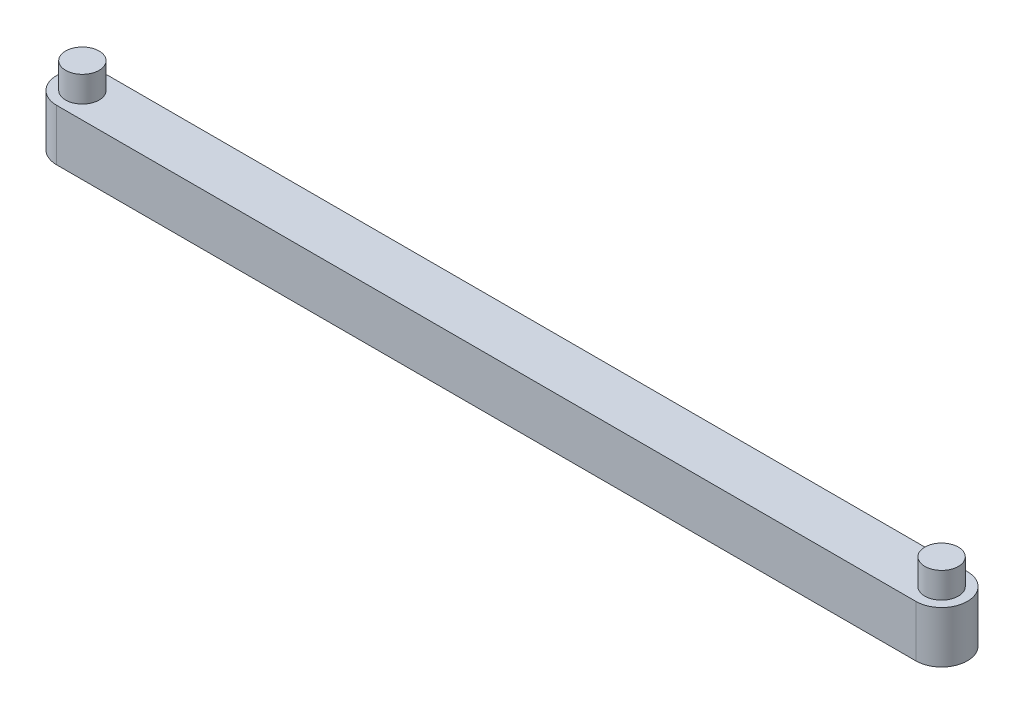
ISO-10303-21;
HEADER;
FILE_DESCRIPTION(('STEP AP214'),'2;1');
FILE_NAME('part.step','',(''),(''),'','','');
FILE_SCHEMA(('AUTOMOTIVE_DESIGN { 1 0 10303 214 1 1 1 1 }'));
ENDSEC;
DATA;
#1=APPLICATION_CONTEXT('core data for automotive mechanical design processes');
#2=APPLICATION_PROTOCOL_DEFINITION('international standard','automotive_design',2000,#1);
#3=PRODUCT_CONTEXT('',#1,'mechanical');
#4=PRODUCT('Part','Part','',(#3));
#5=PRODUCT_RELATED_PRODUCT_CATEGORY('part','',(#4));
#6=PRODUCT_DEFINITION_FORMATION('','',#4);
#7=PRODUCT_DEFINITION_CONTEXT('part definition',#1,'design');
#8=PRODUCT_DEFINITION('design','',#6,#7);
#9=PRODUCT_DEFINITION_SHAPE('','',#8);
#10=(LENGTH_UNIT() NAMED_UNIT(*) SI_UNIT(.MILLI.,.METRE.));
#11=(NAMED_UNIT(*) PLANE_ANGLE_UNIT() SI_UNIT($,.RADIAN.));
#12=(NAMED_UNIT(*) SI_UNIT($,.STERADIAN.) SOLID_ANGLE_UNIT());
#13=UNCERTAINTY_MEASURE_WITH_UNIT(LENGTH_MEASURE(1.E-05),#10,'distance_accuracy_value','');
#14=(GEOMETRIC_REPRESENTATION_CONTEXT(3) GLOBAL_UNCERTAINTY_ASSIGNED_CONTEXT((#13)) GLOBAL_UNIT_ASSIGNED_CONTEXT((#10,
#11,#12)) REPRESENTATION_CONTEXT('',''));
#15=CARTESIAN_POINT('',(0.,0.,0.));
#16=DIRECTION('',(0.,0.,1.));
#17=DIRECTION('',(1.,0.,0.));
#18=AXIS2_PLACEMENT_3D('',#15,#16,#17);
#19=CARTESIAN_POINT('',(250.,-15.,0.));
#20=DIRECTION('',(0.,1.,0.));
#21=DIRECTION('',(0.,0.,1.));
#22=AXIS2_PLACEMENT_3D('',#19,#20,#21);
#23=CYLINDRICAL_SURFACE('',#22,9.74999999999997);
#24=CARTESIAN_POINT('',(250.,-15.,0.));
#25=DIRECTION('',(0.,1.,0.));
#26=DIRECTION('',(0.,0.,1.));
#27=AXIS2_PLACEMENT_3D('',#24,#25,#26);
#28=CIRCLE('',#27,9.74999999999997);
#29=CARTESIAN_POINT('',(250.,-15.,9.74999999999995));
#30=VERTEX_POINT('',#29);
#31=EDGE_CURVE('E291',#30,#30,#28,.T.);
#32=ORIENTED_EDGE('',*,*,#31,.F.);
#33=EDGE_LOOP('',(#32));
#34=FACE_BOUND('',#33,.T.);
#35=CARTESIAN_POINT('',(250.,-3.,0.));
#36=DIRECTION('',(0.,1.,0.));
#37=DIRECTION('',(0.,0.,1.));
#38=AXIS2_PLACEMENT_3D('',#35,#36,#37);
#39=CIRCLE('',#38,9.74999999999997);
#40=CARTESIAN_POINT('',(250.,-3.,9.74999999999995));
#41=VERTEX_POINT('',#40);
#42=EDGE_CURVE('E11',#41,#41,#39,.F.);
#43=ORIENTED_EDGE('',*,*,#42,.F.);
#44=EDGE_LOOP('',(#43));
#45=FACE_BOUND('',#44,.T.);
#46=ADVANCED_FACE('F37',(#34,#45),#23,.F.);
#47=CARTESIAN_POINT('',(-250.,-15.,0.));
#48=DIRECTION('',(0.,1.,0.));
#49=DIRECTION('',(0.,0.,1.));
#50=AXIS2_PLACEMENT_3D('',#47,#48,#49);
#51=CYLINDRICAL_SURFACE('',#50,9.75000000000002);
#52=CARTESIAN_POINT('',(-250.,-15.,0.));
#53=DIRECTION('',(0.,1.,0.));
#54=DIRECTION('',(0.,0.,1.));
#55=AXIS2_PLACEMENT_3D('',#52,#53,#54);
#56=CIRCLE('',#55,9.75000000000002);
#57=CARTESIAN_POINT('',(-250.,-15.,9.75000000000001));
#58=VERTEX_POINT('',#57);
#59=EDGE_CURVE('E287',#58,#58,#56,.T.);
#60=ORIENTED_EDGE('',*,*,#59,.F.);
#61=EDGE_LOOP('',(#60));
#62=FACE_BOUND('',#61,.T.);
#63=CARTESIAN_POINT('',(-250.,-3.,0.));
#64=DIRECTION('',(0.,1.,0.));
#65=DIRECTION('',(0.,0.,1.));
#66=AXIS2_PLACEMENT_3D('',#63,#64,#65);
#67=CIRCLE('',#66,9.75000000000002);
#68=CARTESIAN_POINT('',(-250.,-3.,9.75000000000001));
#69=VERTEX_POINT('',#68);
#70=EDGE_CURVE('E46',#69,#69,#67,.F.);
#71=ORIENTED_EDGE('',*,*,#70,.F.);
#72=EDGE_LOOP('',(#71));
#73=FACE_BOUND('',#72,.T.);
#74=ADVANCED_FACE('F126',(#62,#73),#51,.F.);
#75=CARTESIAN_POINT('',(-250.,15.,0.));
#76=DIRECTION('',(0.,-1.,0.));
#77=DIRECTION('',(0.,0.,-1.));
#78=AXIS2_PLACEMENT_3D('',#75,#76,#77);
#79=CYLINDRICAL_SURFACE('',#78,15.);
#80=CARTESIAN_POINT('',(-250.,-15.,0.));
#81=DIRECTION('',(0.,1.,0.));
#82=DIRECTION('',(0.,0.,1.));
#83=AXIS2_PLACEMENT_3D('',#80,#81,#82);
#84=CIRCLE('',#83,15.);
#85=CARTESIAN_POINT('',(-250.,-15.,-15.));
#86=VERTEX_POINT('',#85);
#87=CARTESIAN_POINT('',(-250.,-15.,15.));
#88=VERTEX_POINT('',#87);
#89=EDGE_CURVE('E105',#86,#88,#84,.T.);
#90=ORIENTED_EDGE('',*,*,#89,.T.);
#91=DIRECTION('',(0.,-1.,0.));
#92=VECTOR('',#91,1.);
#93=CARTESIAN_POINT('',(-250.,15.,15.));
#94=LINE('',#93,#92);
#95=CARTESIAN_POINT('',(-250.,15.,15.));
#96=VERTEX_POINT('',#95);
#97=EDGE_CURVE('E96',#96,#88,#94,.T.);
#98=ORIENTED_EDGE('',*,*,#97,.F.);
#99=CARTESIAN_POINT('',(-250.,15.,0.));
#100=DIRECTION('',(0.,1.,0.));
#101=DIRECTION('',(0.,0.,1.));
#102=AXIS2_PLACEMENT_3D('',#99,#100,#101);
#103=CIRCLE('',#102,15.);
#104=CARTESIAN_POINT('',(-250.,15.,-15.));
#105=VERTEX_POINT('',#104);
#106=EDGE_CURVE('E90',#105,#96,#103,.T.);
#107=ORIENTED_EDGE('',*,*,#106,.F.);
#108=DIRECTION('',(0.,-1.,0.));
#109=VECTOR('',#108,1.);
#110=CARTESIAN_POINT('',(-250.,15.,-15.));
#111=LINE('',#110,#109);
#112=EDGE_CURVE('E101',#105,#86,#111,.T.);
#113=ORIENTED_EDGE('',*,*,#112,.T.);
#114=EDGE_LOOP('',(#90,#98,#107,#113));
#115=FACE_BOUND('',#114,.T.);
#116=ADVANCED_FACE('F39',(#115),#79,.T.);
#117=CARTESIAN_POINT('',(-250.,15.,15.));
#118=DIRECTION('',(0.,0.,-1.));
#119=DIRECTION('',(-1.,0.,0.));
#120=AXIS2_PLACEMENT_3D('',#117,#118,#119);
#121=PLANE('',#120);
#122=DIRECTION('',(1.,0.,0.));
#123=VECTOR('',#122,1.);
#124=CARTESIAN_POINT('',(-250.,-15.,15.));
#125=LINE('',#124,#123);
#126=CARTESIAN_POINT('',(250.,-15.,15.));
#127=VERTEX_POINT('',#126);
#128=EDGE_CURVE('E95',#88,#127,#125,.T.);
#129=ORIENTED_EDGE('',*,*,#128,.T.);
#130=DIRECTION('',(0.,-1.,0.));
#131=VECTOR('',#130,1.);
#132=CARTESIAN_POINT('',(250.,15.,15.));
#133=LINE('',#132,#131);
#134=CARTESIAN_POINT('',(250.,15.,15.));
#135=VERTEX_POINT('',#134);
#136=EDGE_CURVE('E93',#135,#127,#133,.T.);
#137=ORIENTED_EDGE('',*,*,#136,.F.);
#138=DIRECTION('',(1.,0.,0.));
#139=VECTOR('',#138,1.);
#140=CARTESIAN_POINT('',(-250.,15.,15.));
#141=LINE('',#140,#139);
#142=EDGE_CURVE('E85',#96,#135,#141,.T.);
#143=ORIENTED_EDGE('',*,*,#142,.F.);
#144=ORIENTED_EDGE('',*,*,#97,.T.);
#145=EDGE_LOOP('',(#129,#137,#143,#144));
#146=FACE_BOUND('',#145,.T.);
#147=ADVANCED_FACE('F94',(#146),#121,.F.);
#148=CARTESIAN_POINT('',(250.,15.,0.));
#149=DIRECTION('',(0.,-1.,0.));
#150=DIRECTION('',(0.,0.,-1.));
#151=AXIS2_PLACEMENT_3D('',#148,#149,#150);
#152=CYLINDRICAL_SURFACE('',#151,15.);
#153=CARTESIAN_POINT('',(250.,-15.,0.));
#154=DIRECTION('',(0.,1.,0.));
#155=DIRECTION('',(0.,0.,1.));
#156=AXIS2_PLACEMENT_3D('',#153,#154,#155);
#157=CIRCLE('',#156,15.);
#158=CARTESIAN_POINT('',(250.,-15.,-15.));
#159=VERTEX_POINT('',#158);
#160=EDGE_CURVE('E71',#127,#159,#157,.T.);
#161=ORIENTED_EDGE('',*,*,#160,.T.);
#162=DIRECTION('',(0.,-1.,0.));
#163=VECTOR('',#162,1.);
#164=CARTESIAN_POINT('',(250.,15.,-15.));
#165=LINE('',#164,#163);
#166=CARTESIAN_POINT('',(250.,15.,-15.));
#167=VERTEX_POINT('',#166);
#168=EDGE_CURVE('E97',#167,#159,#165,.T.);
#169=ORIENTED_EDGE('',*,*,#168,.F.);
#170=CARTESIAN_POINT('',(250.,15.,0.));
#171=DIRECTION('',(0.,1.,0.));
#172=DIRECTION('',(0.,0.,1.));
#173=AXIS2_PLACEMENT_3D('',#170,#171,#172);
#174=CIRCLE('',#173,15.);
#175=EDGE_CURVE('E88',#135,#167,#174,.T.);
#176=ORIENTED_EDGE('',*,*,#175,.F.);
#177=ORIENTED_EDGE('',*,*,#136,.T.);
#178=EDGE_LOOP('',(#161,#169,#176,#177));
#179=FACE_BOUND('',#178,.T.);
#180=ADVANCED_FACE('F99',(#179),#152,.T.);
#181=CARTESIAN_POINT('',(-250.,15.,-15.));
#182=DIRECTION('',(0.,0.,1.));
#183=DIRECTION('',(1.,0.,0.));
#184=AXIS2_PLACEMENT_3D('',#181,#182,#183);
#185=PLANE('',#184);
#186=DIRECTION('',(-1.,0.,0.));
#187=VECTOR('',#186,1.);
#188=CARTESIAN_POINT('',(-250.,-15.,-15.));
#189=LINE('',#188,#187);
#190=EDGE_CURVE('E77',#159,#86,#189,.T.);
#191=ORIENTED_EDGE('',*,*,#190,.T.);
#192=ORIENTED_EDGE('',*,*,#112,.F.);
#193=DIRECTION('',(-1.,0.,0.));
#194=VECTOR('',#193,1.);
#195=CARTESIAN_POINT('',(-250.,15.,-15.));
#196=LINE('',#195,#194);
#197=EDGE_CURVE('E54',#167,#105,#196,.T.);
#198=ORIENTED_EDGE('',*,*,#197,.F.);
#199=ORIENTED_EDGE('',*,*,#168,.T.);
#200=EDGE_LOOP('',(#191,#192,#198,#199));
#201=FACE_BOUND('',#200,.T.);
#202=ADVANCED_FACE('F160',(#201),#185,.F.);
#203=CARTESIAN_POINT('',(-250.,15.,0.));
#204=DIRECTION('',(0.,1.,0.));
#205=DIRECTION('',(0.,0.,1.));
#206=AXIS2_PLACEMENT_3D('',#203,#204,#205);
#207=PLANE('',#206);
#208=CARTESIAN_POINT('',(250.,15.,0.));
#209=DIRECTION('',(0.,1.,0.));
#210=DIRECTION('',(0.,0.,1.));
#211=AXIS2_PLACEMENT_3D('',#208,#209,#210);
#212=CIRCLE('',#211,9.74999999999997);
#213=CARTESIAN_POINT('',(250.,15.,9.74999999999995));
#214=VERTEX_POINT('',#213);
#215=EDGE_CURVE('E118',#214,#214,#212,.F.);
#216=ORIENTED_EDGE('',*,*,#215,.T.);
#217=EDGE_LOOP('',(#216));
#218=FACE_BOUND('',#217,.T.);
#219=CARTESIAN_POINT('',(-250.,15.,0.));
#220=DIRECTION('',(0.,1.,0.));
#221=DIRECTION('',(0.,0.,1.));
#222=AXIS2_PLACEMENT_3D('',#219,#220,#221);
#223=CIRCLE('',#222,9.75000000000002);
#224=CARTESIAN_POINT('',(-250.,15.,9.75000000000001));
#225=VERTEX_POINT('',#224);
#226=EDGE_CURVE('E108',#225,#225,#223,.F.);
#227=ORIENTED_EDGE('',*,*,#226,.T.);
#228=EDGE_LOOP('',(#227));
#229=FACE_BOUND('',#228,.T.);
#230=ORIENTED_EDGE('',*,*,#106,.T.);
#231=ORIENTED_EDGE('',*,*,#142,.T.);
#232=ORIENTED_EDGE('',*,*,#175,.T.);
#233=ORIENTED_EDGE('',*,*,#197,.T.);
#234=EDGE_LOOP('',(#230,#231,#232,#233));
#235=FACE_BOUND('',#234,.T.);
#236=ADVANCED_FACE('F86',(#218,#229,#235),#207,.T.);
#237=CARTESIAN_POINT('',(-250.,-15.,0.));
#238=DIRECTION('',(0.,1.,0.));
#239=DIRECTION('',(0.,0.,1.));
#240=AXIS2_PLACEMENT_3D('',#237,#238,#239);
#241=PLANE('',#240);
#242=ORIENTED_EDGE('',*,*,#59,.T.);
#243=EDGE_LOOP('',(#242));
#244=FACE_BOUND('',#243,.T.);
#245=ORIENTED_EDGE('',*,*,#31,.T.);
#246=EDGE_LOOP('',(#245));
#247=FACE_BOUND('',#246,.T.);
#248=ORIENTED_EDGE('',*,*,#89,.F.);
#249=ORIENTED_EDGE('',*,*,#190,.F.);
#250=ORIENTED_EDGE('',*,*,#160,.F.);
#251=ORIENTED_EDGE('',*,*,#128,.F.);
#252=EDGE_LOOP('',(#248,#249,#250,#251));
#253=FACE_BOUND('',#252,.T.);
#254=ADVANCED_FACE('F156',(#244,#247,#253),#241,.F.);
#255=CARTESIAN_POINT('',(-250.,30.,0.));
#256=DIRECTION('',(0.,-1.,0.));
#257=DIRECTION('',(0.,0.,-1.));
#258=AXIS2_PLACEMENT_3D('',#255,#256,#257);
#259=CYLINDRICAL_SURFACE('',#258,9.75000000000002);
#260=ORIENTED_EDGE('',*,*,#226,.F.);
#261=EDGE_LOOP('',(#260));
#262=FACE_BOUND('',#261,.T.);
#263=CARTESIAN_POINT('',(-250.,30.,0.));
#264=DIRECTION('',(0.,1.,0.));
#265=DIRECTION('',(0.,0.,1.));
#266=AXIS2_PLACEMENT_3D('',#263,#264,#265);
#267=CIRCLE('',#266,9.75000000000002);
#268=CARTESIAN_POINT('',(-250.,30.,9.75000000000001));
#269=VERTEX_POINT('',#268);
#270=EDGE_CURVE('E117',#269,#269,#267,.T.);
#271=ORIENTED_EDGE('',*,*,#270,.F.);
#272=EDGE_LOOP('',(#271));
#273=FACE_BOUND('',#272,.T.);
#274=ADVANCED_FACE('F152',(#262,#273),#259,.T.);
#275=CARTESIAN_POINT('',(-250.,30.,0.));
#276=DIRECTION('',(0.,1.,0.));
#277=DIRECTION('',(0.,0.,1.));
#278=AXIS2_PLACEMENT_3D('',#275,#276,#277);
#279=PLANE('',#278);
#280=ORIENTED_EDGE('',*,*,#270,.T.);
#281=EDGE_LOOP('',(#280));
#282=FACE_BOUND('',#281,.T.);
#283=ADVANCED_FACE('F145',(#282),#279,.T.);
#284=CARTESIAN_POINT('',(250.,30.,0.));
#285=DIRECTION('',(0.,-1.,0.));
#286=DIRECTION('',(0.,0.,-1.));
#287=AXIS2_PLACEMENT_3D('',#284,#285,#286);
#288=CYLINDRICAL_SURFACE('',#287,9.74999999999997);
#289=ORIENTED_EDGE('',*,*,#215,.F.);
#290=EDGE_LOOP('',(#289));
#291=FACE_BOUND('',#290,.T.);
#292=CARTESIAN_POINT('',(250.,30.,0.));
#293=DIRECTION('',(0.,1.,0.));
#294=DIRECTION('',(0.,0.,1.));
#295=AXIS2_PLACEMENT_3D('',#292,#293,#294);
#296=CIRCLE('',#295,9.74999999999997);
#297=CARTESIAN_POINT('',(250.,30.,9.74999999999995));
#298=VERTEX_POINT('',#297);
#299=EDGE_CURVE('E120',#298,#298,#296,.T.);
#300=ORIENTED_EDGE('',*,*,#299,.F.);
#301=EDGE_LOOP('',(#300));
#302=FACE_BOUND('',#301,.T.);
#303=ADVANCED_FACE('F141',(#291,#302),#288,.T.);
#304=CARTESIAN_POINT('',(250.,30.,0.));
#305=DIRECTION('',(0.,1.,0.));
#306=DIRECTION('',(0.,0.,1.));
#307=AXIS2_PLACEMENT_3D('',#304,#305,#306);
#308=PLANE('',#307);
#309=ORIENTED_EDGE('',*,*,#299,.T.);
#310=EDGE_LOOP('',(#309));
#311=FACE_BOUND('',#310,.T.);
#312=ADVANCED_FACE('F144',(#311),#308,.T.);
#313=CARTESIAN_POINT('',(-250.,-3.,0.));
#314=DIRECTION('',(0.,1.,0.));
#315=DIRECTION('',(0.,0.,1.));
#316=AXIS2_PLACEMENT_3D('',#313,#314,#315);
#317=PLANE('',#316);
#318=ORIENTED_EDGE('',*,*,#70,.T.);
#319=EDGE_LOOP('',(#318));
#320=FACE_BOUND('',#319,.T.);
#321=ADVANCED_FACE('F124',(#320),#317,.F.);
#322=CARTESIAN_POINT('',(250.,-3.,0.));
#323=DIRECTION('',(0.,1.,0.));
#324=DIRECTION('',(0.,0.,1.));
#325=AXIS2_PLACEMENT_3D('',#322,#323,#324);
#326=PLANE('',#325);
#327=ORIENTED_EDGE('',*,*,#42,.T.);
#328=EDGE_LOOP('',(#327));
#329=FACE_BOUND('',#328,.T.);
#330=ADVANCED_FACE('F212',(#329),#326,.F.);
#331=CLOSED_SHELL('',(#46,#74,#116,#147,#180,#202,#236,#254,#274,#283,#303,#312,#321,#330));
#332=MANIFOLD_SOLID_BREP('B2',#331);
#333=ADVANCED_BREP_SHAPE_REPRESENTATION('',(#18,#332),#14);
#334=SHAPE_DEFINITION_REPRESENTATION(#9,#333);
ENDSEC;
END-ISO-10303-21;
